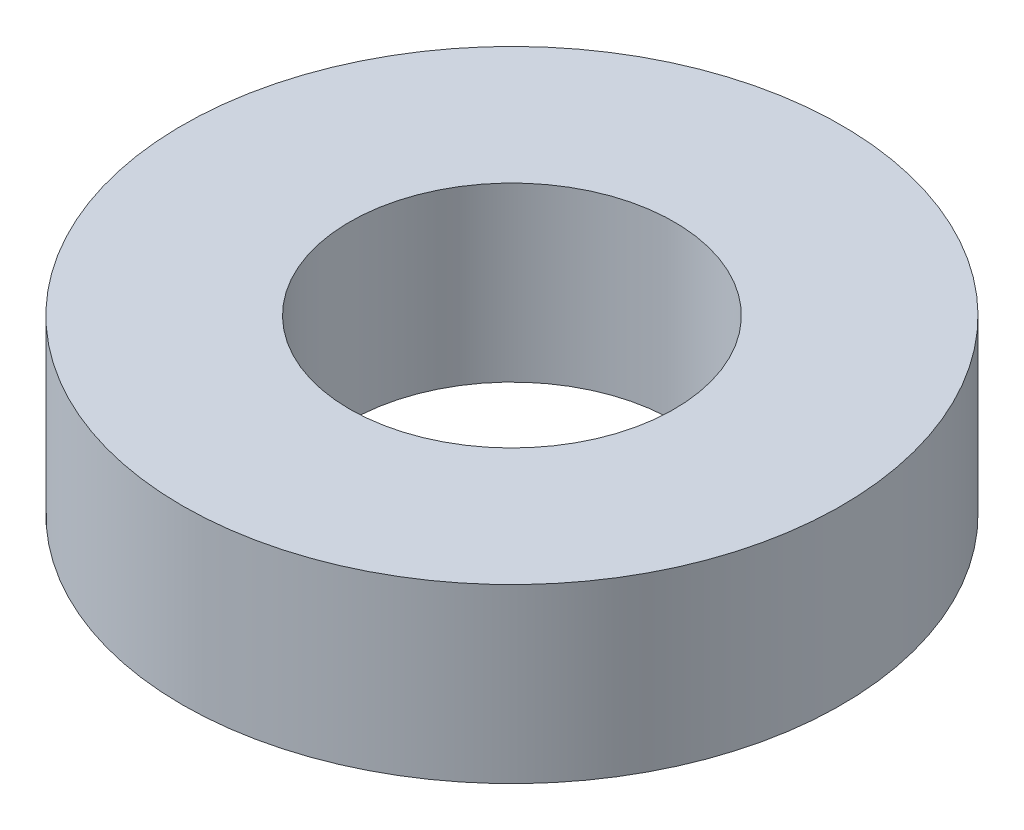
ISO-10303-21;
HEADER;
FILE_DESCRIPTION(('STEP AP214'),'2;1');
FILE_NAME('part.step','',(''),(''),'','','');
FILE_SCHEMA(('AUTOMOTIVE_DESIGN { 1 0 10303 214 1 1 1 1 }'));
ENDSEC;
DATA;
#1=APPLICATION_CONTEXT('core data for automotive mechanical design processes');
#2=APPLICATION_PROTOCOL_DEFINITION('international standard','automotive_design',2000,#1);
#3=PRODUCT_CONTEXT('',#1,'mechanical');
#4=PRODUCT('Part','Part','',(#3));
#5=PRODUCT_RELATED_PRODUCT_CATEGORY('part','',(#4));
#6=PRODUCT_DEFINITION_FORMATION('','',#4);
#7=PRODUCT_DEFINITION_CONTEXT('part definition',#1,'design');
#8=PRODUCT_DEFINITION('design','',#6,#7);
#9=PRODUCT_DEFINITION_SHAPE('','',#8);
#10=(LENGTH_UNIT() NAMED_UNIT(*) SI_UNIT(.MILLI.,.METRE.));
#11=(NAMED_UNIT(*) PLANE_ANGLE_UNIT() SI_UNIT($,.RADIAN.));
#12=(NAMED_UNIT(*) SI_UNIT($,.STERADIAN.) SOLID_ANGLE_UNIT());
#13=UNCERTAINTY_MEASURE_WITH_UNIT(LENGTH_MEASURE(1.E-05),#10,'distance_accuracy_value','');
#14=(GEOMETRIC_REPRESENTATION_CONTEXT(3) GLOBAL_UNCERTAINTY_ASSIGNED_CONTEXT((#13)) GLOBAL_UNIT_ASSIGNED_CONTEXT((#10,
#11,#12)) REPRESENTATION_CONTEXT('',''));
#15=CARTESIAN_POINT('',(0.,0.,0.));
#16=DIRECTION('',(0.,0.,1.));
#17=DIRECTION('',(1.,0.,0.));
#18=AXIS2_PLACEMENT_3D('',#15,#16,#17);
#19=CARTESIAN_POINT('',(0.,1.7,0.));
#20=DIRECTION('',(0.,1.,0.));
#21=DIRECTION('',(0.,0.,1.));
#22=AXIS2_PLACEMENT_3D('',#19,#20,#21);
#23=PLANE('',#22);
#24=CARTESIAN_POINT('',(0.,1.7,0.));
#25=DIRECTION('',(0.,1.,0.));
#26=DIRECTION('',(0.,0.,1.));
#27=AXIS2_PLACEMENT_3D('',#24,#25,#26);
#28=CIRCLE('',#27,3.25);
#29=CARTESIAN_POINT('',(0.,1.7,3.25));
#30=VERTEX_POINT('',#29);
#31=EDGE_CURVE('E10',#30,#30,#28,.T.);
#32=ORIENTED_EDGE('',*,*,#31,.T.);
#33=EDGE_LOOP('',(#32));
#34=FACE_BOUND('',#33,.T.);
#35=CARTESIAN_POINT('',(0.,1.7,0.));
#36=DIRECTION('',(0.,1.,0.));
#37=DIRECTION('',(0.,0.,1.));
#38=AXIS2_PLACEMENT_3D('',#35,#36,#37);
#39=CIRCLE('',#38,1.6);
#40=CARTESIAN_POINT('',(0.,1.7,1.6));
#41=VERTEX_POINT('',#40);
#42=EDGE_CURVE('E44',#41,#41,#39,.T.);
#43=ORIENTED_EDGE('',*,*,#42,.F.);
#44=EDGE_LOOP('',(#43));
#45=FACE_BOUND('',#44,.T.);
#46=ADVANCED_FACE('F33',(#34,#45),#23,.T.);
#47=CARTESIAN_POINT('',(0.,0.,0.));
#48=DIRECTION('',(0.,1.,0.));
#49=DIRECTION('',(0.,0.,1.));
#50=AXIS2_PLACEMENT_3D('',#47,#48,#49);
#51=PLANE('',#50);
#52=CARTESIAN_POINT('',(0.,0.,0.));
#53=DIRECTION('',(0.,1.,0.));
#54=DIRECTION('',(0.,0.,1.));
#55=AXIS2_PLACEMENT_3D('',#52,#53,#54);
#56=CIRCLE('',#55,3.25);
#57=CARTESIAN_POINT('',(0.,0.,3.25));
#58=VERTEX_POINT('',#57);
#59=EDGE_CURVE('E37',#58,#58,#56,.T.);
#60=ORIENTED_EDGE('',*,*,#59,.F.);
#61=EDGE_LOOP('',(#60));
#62=FACE_BOUND('',#61,.T.);
#63=CARTESIAN_POINT('',(0.,0.,0.));
#64=DIRECTION('',(0.,1.,0.));
#65=DIRECTION('',(0.,0.,1.));
#66=AXIS2_PLACEMENT_3D('',#63,#64,#65);
#67=CIRCLE('',#66,1.6);
#68=CARTESIAN_POINT('',(0.,0.,1.6));
#69=VERTEX_POINT('',#68);
#70=EDGE_CURVE('E46',#69,#69,#67,.T.);
#71=ORIENTED_EDGE('',*,*,#70,.T.);
#72=EDGE_LOOP('',(#71));
#73=FACE_BOUND('',#72,.T.);
#74=ADVANCED_FACE('F56',(#62,#73),#51,.F.);
#75=CARTESIAN_POINT('',(0.,1.7,0.));
#76=DIRECTION('',(0.,-1.,0.));
#77=DIRECTION('',(0.,0.,-1.));
#78=AXIS2_PLACEMENT_3D('',#75,#76,#77);
#79=CYLINDRICAL_SURFACE('',#78,3.25);
#80=ORIENTED_EDGE('',*,*,#31,.F.);
#81=EDGE_LOOP('',(#80));
#82=FACE_BOUND('',#81,.T.);
#83=ORIENTED_EDGE('',*,*,#59,.T.);
#84=EDGE_LOOP('',(#83));
#85=FACE_BOUND('',#84,.T.);
#86=ADVANCED_FACE('F35',(#82,#85),#79,.T.);
#87=CARTESIAN_POINT('',(0.,1.7,0.));
#88=DIRECTION('',(0.,-1.,0.));
#89=DIRECTION('',(0.,0.,-1.));
#90=AXIS2_PLACEMENT_3D('',#87,#88,#89);
#91=CYLINDRICAL_SURFACE('',#90,1.6);
#92=ORIENTED_EDGE('',*,*,#42,.T.);
#93=EDGE_LOOP('',(#92));
#94=FACE_BOUND('',#93,.T.);
#95=ORIENTED_EDGE('',*,*,#70,.F.);
#96=EDGE_LOOP('',(#95));
#97=FACE_BOUND('',#96,.T.);
#98=ADVANCED_FACE('F52',(#94,#97),#91,.F.);
#99=CLOSED_SHELL('',(#46,#74,#86,#98));
#100=MANIFOLD_SOLID_BREP('B2',#99);
#101=ADVANCED_BREP_SHAPE_REPRESENTATION('',(#18,#100),#14);
#102=SHAPE_DEFINITION_REPRESENTATION(#9,#101);
ENDSEC;
END-ISO-10303-21;
